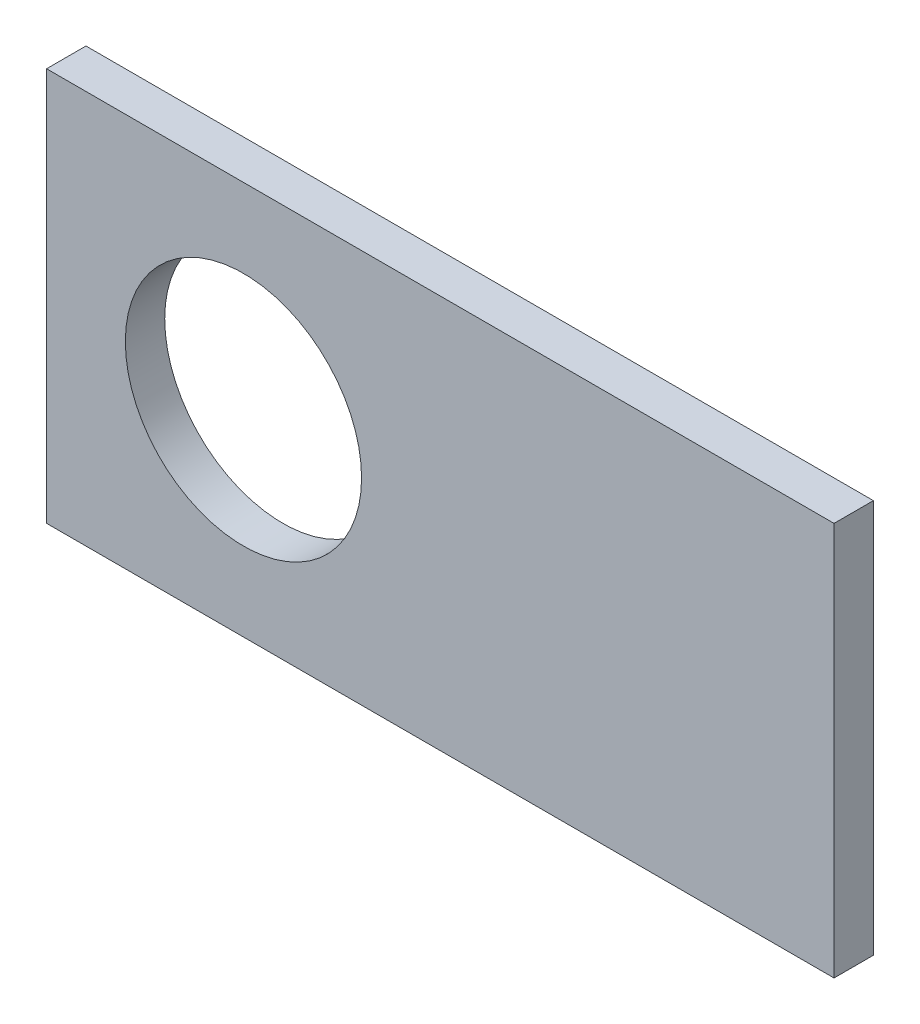
ISO-10303-21;
HEADER;
FILE_DESCRIPTION(('STEP AP214'),'2;1');
FILE_NAME('part.step','',(''),(''),'','','');
FILE_SCHEMA(('AUTOMOTIVE_DESIGN { 1 0 10303 214 1 1 1 1 }'));
ENDSEC;
DATA;
#1=APPLICATION_CONTEXT('core data for automotive mechanical design processes');
#2=APPLICATION_PROTOCOL_DEFINITION('international standard','automotive_design',2000,#1);
#3=PRODUCT_CONTEXT('',#1,'mechanical');
#4=PRODUCT('Part','Part','',(#3));
#5=PRODUCT_RELATED_PRODUCT_CATEGORY('part','',(#4));
#6=PRODUCT_DEFINITION_FORMATION('','',#4);
#7=PRODUCT_DEFINITION_CONTEXT('part definition',#1,'design');
#8=PRODUCT_DEFINITION('design','',#6,#7);
#9=PRODUCT_DEFINITION_SHAPE('','',#8);
#10=(LENGTH_UNIT() NAMED_UNIT(*) SI_UNIT(.MILLI.,.METRE.));
#11=(NAMED_UNIT(*) PLANE_ANGLE_UNIT() SI_UNIT($,.RADIAN.));
#12=(NAMED_UNIT(*) SI_UNIT($,.STERADIAN.) SOLID_ANGLE_UNIT());
#13=UNCERTAINTY_MEASURE_WITH_UNIT(LENGTH_MEASURE(1.E-05),#10,'distance_accuracy_value','');
#14=(GEOMETRIC_REPRESENTATION_CONTEXT(3) GLOBAL_UNCERTAINTY_ASSIGNED_CONTEXT((#13)) GLOBAL_UNIT_ASSIGNED_CONTEXT((#10,
#11,#12)) REPRESENTATION_CONTEXT('',''));
#15=CARTESIAN_POINT('',(0.,0.,0.));
#16=DIRECTION('',(0.,0.,1.));
#17=DIRECTION('',(1.,0.,0.));
#18=AXIS2_PLACEMENT_3D('',#15,#16,#17);
#19=CARTESIAN_POINT('',(0.,0.,10.));
#20=DIRECTION('',(0.,0.,-1.));
#21=DIRECTION('',(-1.,0.,0.));
#22=AXIS2_PLACEMENT_3D('',#19,#20,#21);
#23=PLANE('',#22);
#24=DIRECTION('',(-1.,0.,0.));
#25=VECTOR('',#24,1.);
#26=CARTESIAN_POINT('',(50.,50.,10.));
#27=LINE('',#26,#25);
#28=CARTESIAN_POINT('',(150.,50.,10.));
#29=VERTEX_POINT('',#28);
#30=CARTESIAN_POINT('',(-50.,50.,10.));
#31=VERTEX_POINT('',#30);
#32=EDGE_CURVE('E89',#29,#31,#27,.T.);
#33=ORIENTED_EDGE('',*,*,#32,.T.);
#34=DIRECTION('',(0.,-1.,0.));
#35=VECTOR('',#34,1.);
#36=CARTESIAN_POINT('',(-50.,-50.,10.));
#37=LINE('',#36,#35);
#38=CARTESIAN_POINT('',(-50.,-50.,10.));
#39=VERTEX_POINT('',#38);
#40=EDGE_CURVE('E92',#31,#39,#37,.T.);
#41=ORIENTED_EDGE('',*,*,#40,.T.);
#42=DIRECTION('',(1.,0.,0.));
#43=VECTOR('',#42,1.);
#44=CARTESIAN_POINT('',(-50.,-50.,10.));
#45=LINE('',#44,#43);
#46=CARTESIAN_POINT('',(150.,-50.,10.));
#47=VERTEX_POINT('',#46);
#48=EDGE_CURVE('E96',#39,#47,#45,.T.);
#49=ORIENTED_EDGE('',*,*,#48,.T.);
#50=DIRECTION('',(0.,1.,0.));
#51=VECTOR('',#50,1.);
#52=CARTESIAN_POINT('',(150.,50.,10.));
#53=LINE('',#52,#51);
#54=EDGE_CURVE('E61',#47,#29,#53,.T.);
#55=ORIENTED_EDGE('',*,*,#54,.T.);
#56=EDGE_LOOP('',(#33,#41,#49,#55));
#57=FACE_BOUND('',#56,.T.);
#58=CARTESIAN_POINT('',(0.,0.,10.));
#59=DIRECTION('',(0.,0.,1.));
#60=DIRECTION('',(1.,0.,0.));
#61=AXIS2_PLACEMENT_3D('',#58,#59,#60);
#62=CIRCLE('',#61,30.);
#63=CARTESIAN_POINT('',(30.,0.,10.));
#64=VERTEX_POINT('',#63);
#65=EDGE_CURVE('E115',#64,#64,#62,.T.);
#66=ORIENTED_EDGE('',*,*,#65,.F.);
#67=EDGE_LOOP('',(#66));
#68=FACE_BOUND('',#67,.T.);
#69=ADVANCED_FACE('F43',(#57,#68),#23,.F.);
#70=CARTESIAN_POINT('',(0.,0.,0.));
#71=DIRECTION('',(0.,0.,-1.));
#72=DIRECTION('',(-1.,0.,0.));
#73=AXIS2_PLACEMENT_3D('',#70,#71,#72);
#74=PLANE('',#73);
#75=DIRECTION('',(-1.,0.,0.));
#76=VECTOR('',#75,1.);
#77=CARTESIAN_POINT('',(-50.,50.,0.));
#78=LINE('',#77,#76);
#79=CARTESIAN_POINT('',(150.,50.,0.));
#80=VERTEX_POINT('',#79);
#81=CARTESIAN_POINT('',(-50.,50.,0.));
#82=VERTEX_POINT('',#81);
#83=EDGE_CURVE('E84',#80,#82,#78,.T.);
#84=ORIENTED_EDGE('',*,*,#83,.F.);
#85=DIRECTION('',(0.,1.,0.));
#86=VECTOR('',#85,1.);
#87=CARTESIAN_POINT('',(150.,50.,0.));
#88=LINE('',#87,#86);
#89=CARTESIAN_POINT('',(150.,-50.,0.));
#90=VERTEX_POINT('',#89);
#91=EDGE_CURVE('E120',#90,#80,#88,.T.);
#92=ORIENTED_EDGE('',*,*,#91,.F.);
#93=DIRECTION('',(1.,0.,0.));
#94=VECTOR('',#93,1.);
#95=CARTESIAN_POINT('',(50.,-50.,0.));
#96=LINE('',#95,#94);
#97=CARTESIAN_POINT('',(-50.,-50.,0.));
#98=VERTEX_POINT('',#97);
#99=EDGE_CURVE('E77',#98,#90,#96,.T.);
#100=ORIENTED_EDGE('',*,*,#99,.F.);
#101=DIRECTION('',(0.,-1.,0.));
#102=VECTOR('',#101,1.);
#103=CARTESIAN_POINT('',(-50.,-50.,0.));
#104=LINE('',#103,#102);
#105=EDGE_CURVE('E102',#82,#98,#104,.T.);
#106=ORIENTED_EDGE('',*,*,#105,.F.);
#107=EDGE_LOOP('',(#84,#92,#100,#106));
#108=FACE_BOUND('',#107,.T.);
#109=CARTESIAN_POINT('',(0.,0.,0.));
#110=DIRECTION('',(0.,0.,1.));
#111=DIRECTION('',(1.,0.,0.));
#112=AXIS2_PLACEMENT_3D('',#109,#110,#111);
#113=CIRCLE('',#112,30.);
#114=CARTESIAN_POINT('',(30.,0.,0.));
#115=VERTEX_POINT('',#114);
#116=EDGE_CURVE('E135',#115,#115,#113,.T.);
#117=ORIENTED_EDGE('',*,*,#116,.T.);
#118=EDGE_LOOP('',(#117));
#119=FACE_BOUND('',#118,.T.);
#120=ADVANCED_FACE('F129',(#108,#119),#74,.T.);
#121=CARTESIAN_POINT('',(-50.,50.,10.));
#122=DIRECTION('',(0.,-1.,0.));
#123=DIRECTION('',(0.,0.,-1.));
#124=AXIS2_PLACEMENT_3D('',#121,#122,#123);
#125=PLANE('',#124);
#126=ORIENTED_EDGE('',*,*,#83,.T.);
#127=DIRECTION('',(0.,0.,-1.));
#128=VECTOR('',#127,1.);
#129=CARTESIAN_POINT('',(-50.,50.,10.));
#130=LINE('',#129,#128);
#131=EDGE_CURVE('E11',#31,#82,#130,.T.);
#132=ORIENTED_EDGE('',*,*,#131,.F.);
#133=ORIENTED_EDGE('',*,*,#32,.F.);
#134=DIRECTION('',(0.,0.,-1.));
#135=VECTOR('',#134,1.);
#136=CARTESIAN_POINT('',(150.,50.,10.));
#137=LINE('',#136,#135);
#138=EDGE_CURVE('E109',#29,#80,#137,.T.);
#139=ORIENTED_EDGE('',*,*,#138,.T.);
#140=EDGE_LOOP('',(#126,#132,#133,#139));
#141=FACE_BOUND('',#140,.T.);
#142=ADVANCED_FACE('F45',(#141),#125,.F.);
#143=CARTESIAN_POINT('',(-50.,-50.,10.));
#144=DIRECTION('',(1.,0.,0.));
#145=DIRECTION('',(0.,0.,-1.));
#146=AXIS2_PLACEMENT_3D('',#143,#144,#145);
#147=PLANE('',#146);
#148=ORIENTED_EDGE('',*,*,#105,.T.);
#149=DIRECTION('',(0.,0.,-1.));
#150=VECTOR('',#149,1.);
#151=CARTESIAN_POINT('',(-50.,-50.,10.));
#152=LINE('',#151,#150);
#153=EDGE_CURVE('E53',#39,#98,#152,.T.);
#154=ORIENTED_EDGE('',*,*,#153,.F.);
#155=ORIENTED_EDGE('',*,*,#40,.F.);
#156=ORIENTED_EDGE('',*,*,#131,.T.);
#157=EDGE_LOOP('',(#148,#154,#155,#156));
#158=FACE_BOUND('',#157,.T.);
#159=ADVANCED_FACE('F101',(#158),#147,.F.);
#160=CARTESIAN_POINT('',(50.,-50.,10.));
#161=DIRECTION('',(0.,1.,0.));
#162=DIRECTION('',(0.,0.,1.));
#163=AXIS2_PLACEMENT_3D('',#160,#161,#162);
#164=PLANE('',#163);
#165=ORIENTED_EDGE('',*,*,#99,.T.);
#166=DIRECTION('',(0.,0.,-1.));
#167=VECTOR('',#166,1.);
#168=CARTESIAN_POINT('',(150.,-50.,10.));
#169=LINE('',#168,#167);
#170=EDGE_CURVE('E104',#47,#90,#169,.T.);
#171=ORIENTED_EDGE('',*,*,#170,.F.);
#172=ORIENTED_EDGE('',*,*,#48,.F.);
#173=ORIENTED_EDGE('',*,*,#153,.T.);
#174=EDGE_LOOP('',(#165,#171,#172,#173));
#175=FACE_BOUND('',#174,.T.);
#176=ADVANCED_FACE('F105',(#175),#164,.F.);
#177=CARTESIAN_POINT('',(150.,50.,10.));
#178=DIRECTION('',(-1.,0.,0.));
#179=DIRECTION('',(0.,-1.,0.));
#180=AXIS2_PLACEMENT_3D('',#177,#178,#179);
#181=PLANE('',#180);
#182=ORIENTED_EDGE('',*,*,#91,.T.);
#183=ORIENTED_EDGE('',*,*,#138,.F.);
#184=ORIENTED_EDGE('',*,*,#54,.F.);
#185=ORIENTED_EDGE('',*,*,#170,.T.);
#186=EDGE_LOOP('',(#182,#183,#184,#185));
#187=FACE_BOUND('',#186,.T.);
#188=ADVANCED_FACE('F128',(#187),#181,.F.);
#189=CARTESIAN_POINT('',(0.,0.,10.));
#190=DIRECTION('',(0.,0.,-1.));
#191=DIRECTION('',(-1.,0.,0.));
#192=AXIS2_PLACEMENT_3D('',#189,#190,#191);
#193=CYLINDRICAL_SURFACE('',#192,30.);
#194=ORIENTED_EDGE('',*,*,#65,.T.);
#195=EDGE_LOOP('',(#194));
#196=FACE_BOUND('',#195,.T.);
#197=ORIENTED_EDGE('',*,*,#116,.F.);
#198=EDGE_LOOP('',(#197));
#199=FACE_BOUND('',#198,.T.);
#200=ADVANCED_FACE('F145',(#196,#199),#193,.F.);
#201=CLOSED_SHELL('',(#69,#120,#142,#159,#176,#188,#200));
#202=MANIFOLD_SOLID_BREP('B2',#201);
#203=ADVANCED_BREP_SHAPE_REPRESENTATION('',(#18,#202),#14);
#204=SHAPE_DEFINITION_REPRESENTATION(#9,#203);
ENDSEC;
END-ISO-10303-21;
